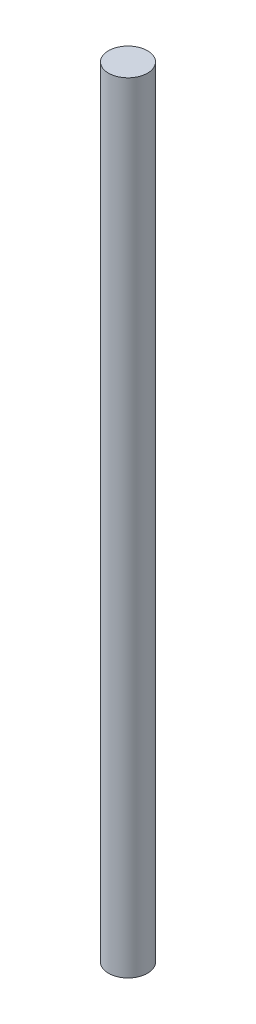
ISO-10303-21;
HEADER;
FILE_DESCRIPTION(('STEP AP214'),'2;1');
FILE_NAME('part.step','',(''),(''),'','','');
FILE_SCHEMA(('AUTOMOTIVE_DESIGN { 1 0 10303 214 1 1 1 1 }'));
ENDSEC;
DATA;
#1=APPLICATION_CONTEXT('core data for automotive mechanical design processes');
#2=APPLICATION_PROTOCOL_DEFINITION('international standard','automotive_design',2000,#1);
#3=PRODUCT_CONTEXT('',#1,'mechanical');
#4=PRODUCT('Part','Part','',(#3));
#5=PRODUCT_RELATED_PRODUCT_CATEGORY('part','',(#4));
#6=PRODUCT_DEFINITION_FORMATION('','',#4);
#7=PRODUCT_DEFINITION_CONTEXT('part definition',#1,'design');
#8=PRODUCT_DEFINITION('design','',#6,#7);
#9=PRODUCT_DEFINITION_SHAPE('','',#8);
#10=(LENGTH_UNIT() NAMED_UNIT(*) SI_UNIT(.MILLI.,.METRE.));
#11=(NAMED_UNIT(*) PLANE_ANGLE_UNIT() SI_UNIT($,.RADIAN.));
#12=(NAMED_UNIT(*) SI_UNIT($,.STERADIAN.) SOLID_ANGLE_UNIT());
#13=UNCERTAINTY_MEASURE_WITH_UNIT(LENGTH_MEASURE(1.E-05),#10,'distance_accuracy_value','');
#14=(GEOMETRIC_REPRESENTATION_CONTEXT(3) GLOBAL_UNCERTAINTY_ASSIGNED_CONTEXT((#13)) GLOBAL_UNIT_ASSIGNED_CONTEXT((#10,
#11,#12)) REPRESENTATION_CONTEXT('',''));
#15=CARTESIAN_POINT('',(0.,0.,0.));
#16=DIRECTION('',(0.,0.,1.));
#17=DIRECTION('',(1.,0.,0.));
#18=AXIS2_PLACEMENT_3D('',#15,#16,#17);
#19=CARTESIAN_POINT('',(0.,100.,0.));
#20=DIRECTION('',(0.,-1.,0.));
#21=DIRECTION('',(0.,0.,-1.));
#22=AXIS2_PLACEMENT_3D('',#19,#20,#21);
#23=CYLINDRICAL_SURFACE('',#22,2.5);
#24=CARTESIAN_POINT('',(0.,100.,0.));
#25=DIRECTION('',(0.,1.,0.));
#26=DIRECTION('',(0.,0.,1.));
#27=AXIS2_PLACEMENT_3D('',#24,#25,#26);
#28=CIRCLE('',#27,2.5);
#29=CARTESIAN_POINT('',(0.,100.,2.5));
#30=VERTEX_POINT('',#29);
#31=EDGE_CURVE('E10',#30,#30,#28,.T.);
#32=ORIENTED_EDGE('',*,*,#31,.F.);
#33=EDGE_LOOP('',(#32));
#34=FACE_BOUND('',#33,.T.);
#35=CARTESIAN_POINT('',(0.,0.,0.));
#36=DIRECTION('',(0.,1.,0.));
#37=DIRECTION('',(0.,0.,1.));
#38=AXIS2_PLACEMENT_3D('',#35,#36,#37);
#39=CIRCLE('',#38,2.5);
#40=CARTESIAN_POINT('',(0.,0.,2.5));
#41=VERTEX_POINT('',#40);
#42=EDGE_CURVE('E34',#41,#41,#39,.T.);
#43=ORIENTED_EDGE('',*,*,#42,.T.);
#44=EDGE_LOOP('',(#43));
#45=FACE_BOUND('',#44,.T.);
#46=ADVANCED_FACE('F31',(#34,#45),#23,.T.);
#47=CARTESIAN_POINT('',(0.,100.,0.));
#48=DIRECTION('',(0.,1.,0.));
#49=DIRECTION('',(0.,0.,1.));
#50=AXIS2_PLACEMENT_3D('',#47,#48,#49);
#51=PLANE('',#50);
#52=ORIENTED_EDGE('',*,*,#31,.T.);
#53=EDGE_LOOP('',(#52));
#54=FACE_BOUND('',#53,.T.);
#55=ADVANCED_FACE('F46',(#54),#51,.T.);
#56=CARTESIAN_POINT('',(0.,0.,0.));
#57=DIRECTION('',(0.,1.,0.));
#58=DIRECTION('',(0.,0.,1.));
#59=AXIS2_PLACEMENT_3D('',#56,#57,#58);
#60=PLANE('',#59);
#61=ORIENTED_EDGE('',*,*,#42,.F.);
#62=EDGE_LOOP('',(#61));
#63=FACE_BOUND('',#62,.T.);
#64=ADVANCED_FACE('F44',(#63),#60,.F.);
#65=CLOSED_SHELL('',(#46,#55,#64));
#66=MANIFOLD_SOLID_BREP('B2',#65);
#67=ADVANCED_BREP_SHAPE_REPRESENTATION('',(#18,#66),#14);
#68=SHAPE_DEFINITION_REPRESENTATION(#9,#67);
ENDSEC;
END-ISO-10303-21;
